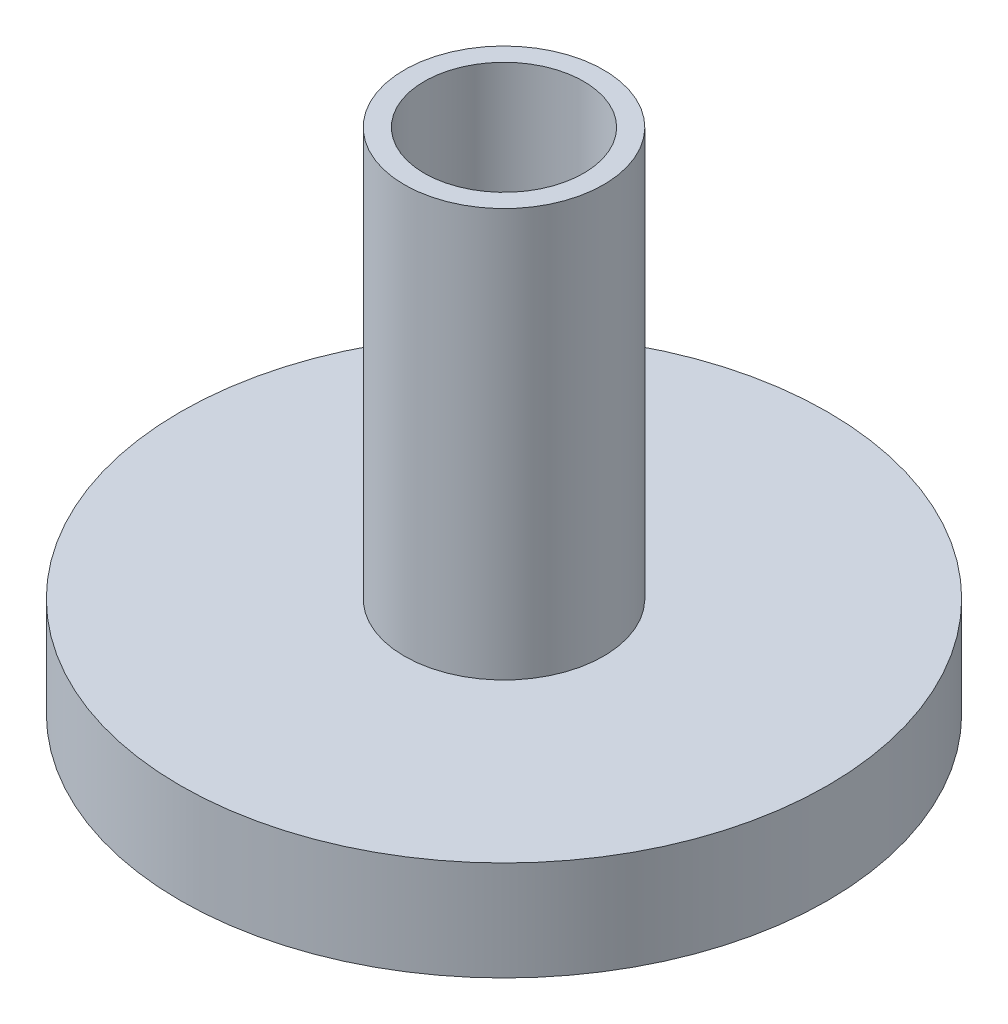
ISO-10303-21;
HEADER;
FILE_DESCRIPTION(('STEP AP214'),'2;1');
FILE_NAME('part.step','',(''),(''),'','','');
FILE_SCHEMA(('AUTOMOTIVE_DESIGN { 1 0 10303 214 1 1 1 1 }'));
ENDSEC;
DATA;
#1=APPLICATION_CONTEXT('core data for automotive mechanical design processes');
#2=APPLICATION_PROTOCOL_DEFINITION('international standard','automotive_design',2000,#1);
#3=PRODUCT_CONTEXT('',#1,'mechanical');
#4=PRODUCT('Part','Part','',(#3));
#5=PRODUCT_RELATED_PRODUCT_CATEGORY('part','',(#4));
#6=PRODUCT_DEFINITION_FORMATION('','',#4);
#7=PRODUCT_DEFINITION_CONTEXT('part definition',#1,'design');
#8=PRODUCT_DEFINITION('design','',#6,#7);
#9=PRODUCT_DEFINITION_SHAPE('','',#8);
#10=(LENGTH_UNIT() NAMED_UNIT(*) SI_UNIT(.MILLI.,.METRE.));
#11=(NAMED_UNIT(*) PLANE_ANGLE_UNIT() SI_UNIT($,.RADIAN.));
#12=(NAMED_UNIT(*) SI_UNIT($,.STERADIAN.) SOLID_ANGLE_UNIT());
#13=UNCERTAINTY_MEASURE_WITH_UNIT(LENGTH_MEASURE(1.E-05),#10,'distance_accuracy_value','');
#14=(GEOMETRIC_REPRESENTATION_CONTEXT(3) GLOBAL_UNCERTAINTY_ASSIGNED_CONTEXT((#13)) GLOBAL_UNIT_ASSIGNED_CONTEXT((#10,
#11,#12)) REPRESENTATION_CONTEXT('',''));
#15=CARTESIAN_POINT('',(0.,0.,0.));
#16=DIRECTION('',(0.,0.,1.));
#17=DIRECTION('',(1.,0.,0.));
#18=AXIS2_PLACEMENT_3D('',#15,#16,#17);
#19=CARTESIAN_POINT('',(0.,26.035,0.));
#20=DIRECTION('',(0.,1.,0.));
#21=DIRECTION('',(0.,0.,1.));
#22=AXIS2_PLACEMENT_3D('',#19,#20,#21);
#23=PLANE('',#22);
#24=CARTESIAN_POINT('',(0.,26.035,0.));
#25=DIRECTION('',(0.,1.,0.));
#26=DIRECTION('',(0.,0.,1.));
#27=AXIS2_PLACEMENT_3D('',#24,#25,#26);
#28=CIRCLE('',#27,6.35);
#29=CARTESIAN_POINT('',(0.,26.035,6.35));
#30=VERTEX_POINT('',#29);
#31=EDGE_CURVE('E39',#30,#30,#28,.T.);
#32=ORIENTED_EDGE('',*,*,#31,.T.);
#33=EDGE_LOOP('',(#32));
#34=FACE_BOUND('',#33,.T.);
#35=CARTESIAN_POINT('',(0.,26.035,0.));
#36=DIRECTION('',(0.,1.,0.));
#37=DIRECTION('',(0.,0.,1.));
#38=AXIS2_PLACEMENT_3D('',#35,#36,#37);
#39=CIRCLE('',#38,5.08);
#40=CARTESIAN_POINT('',(0.,26.035,5.08));
#41=VERTEX_POINT('',#40);
#42=EDGE_CURVE('E43',#41,#41,#39,.T.);
#43=ORIENTED_EDGE('',*,*,#42,.F.);
#44=EDGE_LOOP('',(#43));
#45=FACE_BOUND('',#44,.T.);
#46=ADVANCED_FACE('F32',(#34,#45),#23,.T.);
#47=CARTESIAN_POINT('',(0.,26.035,0.));
#48=DIRECTION('',(0.,-1.,0.));
#49=DIRECTION('',(0.,0.,-1.));
#50=AXIS2_PLACEMENT_3D('',#47,#48,#49);
#51=CYLINDRICAL_SURFACE('',#50,6.35);
#52=ORIENTED_EDGE('',*,*,#31,.F.);
#53=EDGE_LOOP('',(#52));
#54=FACE_BOUND('',#53,.T.);
#55=CARTESIAN_POINT('',(0.,0.,0.));
#56=DIRECTION('',(0.,1.,0.));
#57=DIRECTION('',(0.,0.,1.));
#58=AXIS2_PLACEMENT_3D('',#55,#56,#57);
#59=CIRCLE('',#58,6.35);
#60=CARTESIAN_POINT('',(0.,0.,6.35));
#61=VERTEX_POINT('',#60);
#62=EDGE_CURVE('E48',#61,#61,#59,.T.);
#63=ORIENTED_EDGE('',*,*,#62,.T.);
#64=EDGE_LOOP('',(#63));
#65=FACE_BOUND('',#64,.T.);
#66=ADVANCED_FACE('F34',(#54,#65),#51,.T.);
#67=CARTESIAN_POINT('',(0.,26.035,0.));
#68=DIRECTION('',(0.,-1.,0.));
#69=DIRECTION('',(0.,0.,-1.));
#70=AXIS2_PLACEMENT_3D('',#67,#68,#69);
#71=CYLINDRICAL_SURFACE('',#70,5.08);
#72=CARTESIAN_POINT('',(0.,15.875,0.));
#73=DIRECTION('',(0.,1.,0.));
#74=DIRECTION('',(0.,0.,1.));
#75=AXIS2_PLACEMENT_3D('',#72,#73,#74);
#76=CIRCLE('',#75,5.08);
#77=CARTESIAN_POINT('',(0.,15.875,5.08));
#78=VERTEX_POINT('',#77);
#79=EDGE_CURVE('E11',#78,#78,#76,.T.);
#80=ORIENTED_EDGE('',*,*,#79,.F.);
#81=EDGE_LOOP('',(#80));
#82=FACE_BOUND('',#81,.T.);
#83=ORIENTED_EDGE('',*,*,#42,.T.);
#84=EDGE_LOOP('',(#83));
#85=FACE_BOUND('',#84,.T.);
#86=ADVANCED_FACE('F82',(#82,#85),#71,.F.);
#87=CARTESIAN_POINT('',(0.,-6.35,0.));
#88=DIRECTION('',(0.,1.,0.));
#89=DIRECTION('',(0.,0.,1.));
#90=AXIS2_PLACEMENT_3D('',#87,#88,#89);
#91=CYLINDRICAL_SURFACE('',#90,20.6375);
#92=CARTESIAN_POINT('',(0.,-6.35,0.));
#93=DIRECTION('',(0.,-1.,0.));
#94=DIRECTION('',(0.,0.,-1.));
#95=AXIS2_PLACEMENT_3D('',#92,#93,#94);
#96=CIRCLE('',#95,20.6375);
#97=CARTESIAN_POINT('',(0.,-6.35,-20.6375));
#98=VERTEX_POINT('',#97);
#99=EDGE_CURVE('E52',#98,#98,#96,.T.);
#100=ORIENTED_EDGE('',*,*,#99,.F.);
#101=EDGE_LOOP('',(#100));
#102=FACE_BOUND('',#101,.T.);
#103=CARTESIAN_POINT('',(0.,0.,0.));
#104=DIRECTION('',(0.,-1.,0.));
#105=DIRECTION('',(0.,0.,-1.));
#106=AXIS2_PLACEMENT_3D('',#103,#104,#105);
#107=CIRCLE('',#106,20.6375);
#108=CARTESIAN_POINT('',(0.,0.,-20.6375));
#109=VERTEX_POINT('',#108);
#110=EDGE_CURVE('E56',#109,#109,#107,.T.);
#111=ORIENTED_EDGE('',*,*,#110,.T.);
#112=EDGE_LOOP('',(#111));
#113=FACE_BOUND('',#112,.T.);
#114=ADVANCED_FACE('F63',(#102,#113),#91,.T.);
#115=CARTESIAN_POINT('',(0.,-6.35,0.));
#116=DIRECTION('',(0.,-1.,0.));
#117=DIRECTION('',(0.,0.,-1.));
#118=AXIS2_PLACEMENT_3D('',#115,#116,#117);
#119=PLANE('',#118);
#120=ORIENTED_EDGE('',*,*,#99,.T.);
#121=EDGE_LOOP('',(#120));
#122=FACE_BOUND('',#121,.T.);
#123=ADVANCED_FACE('F68',(#122),#119,.T.);
#124=CARTESIAN_POINT('',(0.,0.,0.));
#125=DIRECTION('',(0.,-1.,0.));
#126=DIRECTION('',(0.,0.,-1.));
#127=AXIS2_PLACEMENT_3D('',#124,#125,#126);
#128=PLANE('',#127);
#129=ORIENTED_EDGE('',*,*,#62,.F.);
#130=EDGE_LOOP('',(#129));
#131=FACE_BOUND('',#130,.T.);
#132=ORIENTED_EDGE('',*,*,#110,.F.);
#133=EDGE_LOOP('',(#132));
#134=FACE_BOUND('',#133,.T.);
#135=ADVANCED_FACE('F65',(#131,#134),#128,.F.);
#136=CARTESIAN_POINT('',(0.,15.875,0.));
#137=DIRECTION('',(0.,1.,0.));
#138=DIRECTION('',(0.,0.,1.));
#139=AXIS2_PLACEMENT_3D('',#136,#137,#138);
#140=PLANE('',#139);
#141=ORIENTED_EDGE('',*,*,#79,.T.);
#142=EDGE_LOOP('',(#141));
#143=FACE_BOUND('',#142,.T.);
#144=ADVANCED_FACE('F67',(#143),#140,.T.);
#145=CLOSED_SHELL('',(#46,#66,#86,#114,#123,#135,#144));
#146=MANIFOLD_SOLID_BREP('B2',#145);
#147=ADVANCED_BREP_SHAPE_REPRESENTATION('',(#18,#146),#14);
#148=SHAPE_DEFINITION_REPRESENTATION(#9,#147);
ENDSEC;
END-ISO-10303-21;
